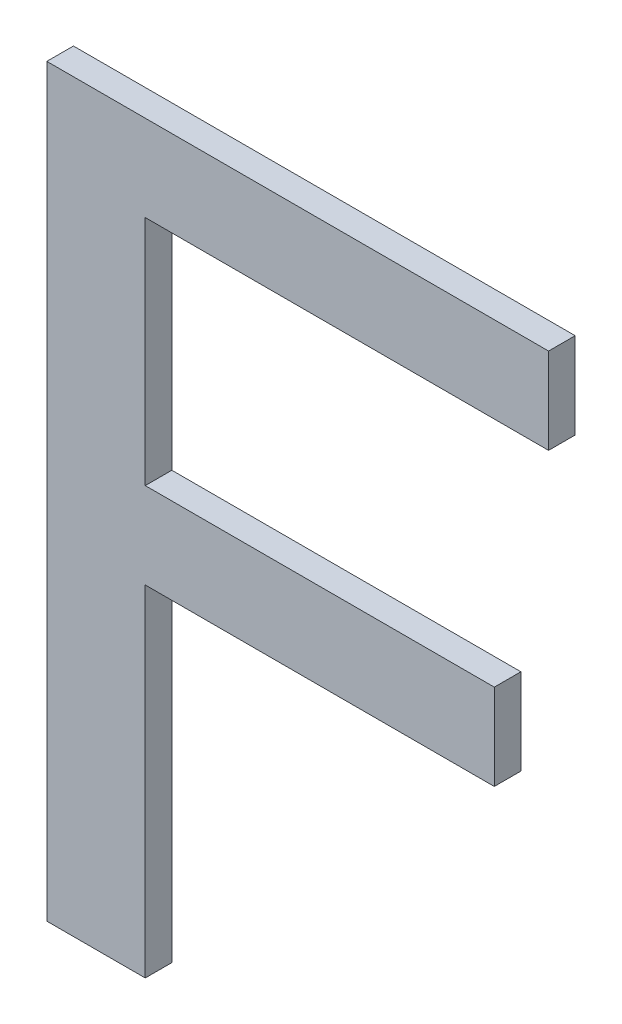
ISO-10303-21;
HEADER;
FILE_DESCRIPTION(('STEP AP214'),'2;1');
FILE_NAME('part.step','',(''),(''),'','','');
FILE_SCHEMA(('AUTOMOTIVE_DESIGN { 1 0 10303 214 1 1 1 1 }'));
ENDSEC;
DATA;
#1=APPLICATION_CONTEXT('core data for automotive mechanical design processes');
#2=APPLICATION_PROTOCOL_DEFINITION('international standard','automotive_design',2000,#1);
#3=PRODUCT_CONTEXT('',#1,'mechanical');
#4=PRODUCT('Part','Part','',(#3));
#5=PRODUCT_RELATED_PRODUCT_CATEGORY('part','',(#4));
#6=PRODUCT_DEFINITION_FORMATION('','',#4);
#7=PRODUCT_DEFINITION_CONTEXT('part definition',#1,'design');
#8=PRODUCT_DEFINITION('design','',#6,#7);
#9=PRODUCT_DEFINITION_SHAPE('','',#8);
#10=(LENGTH_UNIT() NAMED_UNIT(*) SI_UNIT(.MILLI.,.METRE.));
#11=(NAMED_UNIT(*) PLANE_ANGLE_UNIT() SI_UNIT($,.RADIAN.));
#12=(NAMED_UNIT(*) SI_UNIT($,.STERADIAN.) SOLID_ANGLE_UNIT());
#13=UNCERTAINTY_MEASURE_WITH_UNIT(LENGTH_MEASURE(1.E-05),#10,'distance_accuracy_value','');
#14=(GEOMETRIC_REPRESENTATION_CONTEXT(3) GLOBAL_UNCERTAINTY_ASSIGNED_CONTEXT((#13)) GLOBAL_UNIT_ASSIGNED_CONTEXT((#10,
#11,#12)) REPRESENTATION_CONTEXT('',''));
#15=CARTESIAN_POINT('',(0.,0.,0.));
#16=DIRECTION('',(0.,0.,1.));
#17=DIRECTION('',(1.,0.,0.));
#18=AXIS2_PLACEMENT_3D('',#15,#16,#17);
#19=CARTESIAN_POINT('',(10.115104482534,0.861077292451,0.05));
#20=DIRECTION('',(0.,0.,1.));
#21=DIRECTION('',(1.,0.,0.));
#22=AXIS2_PLACEMENT_3D('',#19,#20,#21);
#23=PLANE('',#22);
#24=DIRECTION('',(0.,1.,0.));
#25=VECTOR('',#24,1.);
#26=CARTESIAN_POINT('',(9.77316497093,0.,0.05));
#27=LINE('',#26,#25);
#28=CARTESIAN_POINT('',(9.77316497093,0.,0.05));
#29=VERTEX_POINT('',#28);
#30=CARTESIAN_POINT('',(9.77316497093,1.4,0.05));
#31=VERTEX_POINT('',#30);
#32=EDGE_CURVE('E144',#29,#31,#27,.T.);
#33=ORIENTED_EDGE('',*,*,#32,.F.);
#34=DIRECTION('',(-1.,0.,0.));
#35=VECTOR('',#34,1.);
#36=CARTESIAN_POINT('',(9.958212209302,0.,0.05));
#37=LINE('',#36,#35);
#38=CARTESIAN_POINT('',(9.958212209302,0.,0.05));
#39=VERTEX_POINT('',#38);
#40=EDGE_CURVE('E142',#39,#29,#37,.T.);
#41=ORIENTED_EDGE('',*,*,#40,.F.);
#42=DIRECTION('',(0.,-1.,0.));
#43=VECTOR('',#42,1.);
#44=CARTESIAN_POINT('',(9.958212209302,0.639970930233,0.05));
#45=LINE('',#44,#43);
#46=CARTESIAN_POINT('',(9.958212209302,0.639970930233,0.05));
#47=VERTEX_POINT('',#46);
#48=EDGE_CURVE('E130',#47,#39,#45,.T.);
#49=ORIENTED_EDGE('',*,*,#48,.F.);
#50=DIRECTION('',(-1.,0.,0.));
#51=VECTOR('',#50,1.);
#52=CARTESIAN_POINT('',(10.614462209302,0.639970930233,0.05));
#53=LINE('',#52,#51);
#54=CARTESIAN_POINT('',(10.614462209302,0.639970930233,0.05));
#55=VERTEX_POINT('',#54);
#56=EDGE_CURVE('E180',#55,#47,#53,.T.);
#57=ORIENTED_EDGE('',*,*,#56,.F.);
#58=DIRECTION('',(0.,-1.,0.));
#59=VECTOR('',#58,1.);
#60=CARTESIAN_POINT('',(10.614462209302,0.801744186047,0.05));
#61=LINE('',#60,#59);
#62=CARTESIAN_POINT('',(10.614462209302,0.801744186047,0.05));
#63=VERTEX_POINT('',#62);
#64=EDGE_CURVE('E203',#63,#55,#61,.T.);
#65=ORIENTED_EDGE('',*,*,#64,.F.);
#66=DIRECTION('',(1.,0.,0.));
#67=VECTOR('',#66,1.);
#68=CARTESIAN_POINT('',(9.958212209302,0.801744186047,0.05));
#69=LINE('',#68,#67);
#70=CARTESIAN_POINT('',(9.958212209302,0.801744186047,0.05));
#71=VERTEX_POINT('',#70);
#72=EDGE_CURVE('E173',#71,#63,#69,.T.);
#73=ORIENTED_EDGE('',*,*,#72,.F.);
#74=DIRECTION('',(0.,-1.,0.));
#75=VECTOR('',#74,1.);
#76=CARTESIAN_POINT('',(9.958212209302,1.238226744186,0.05));
#77=LINE('',#76,#75);
#78=CARTESIAN_POINT('',(9.958212209302,1.238226744186,0.05));
#79=VERTEX_POINT('',#78);
#80=EDGE_CURVE('E165',#79,#71,#77,.T.);
#81=ORIENTED_EDGE('',*,*,#80,.F.);
#82=DIRECTION('',(-1.,0.,0.));
#83=VECTOR('',#82,1.);
#84=CARTESIAN_POINT('',(10.71652434593,1.238226744186,0.05));
#85=LINE('',#84,#83);
#86=CARTESIAN_POINT('',(10.71652434593,1.238226744186,0.05));
#87=VERTEX_POINT('',#86);
#88=EDGE_CURVE('E63',#87,#79,#85,.T.);
#89=ORIENTED_EDGE('',*,*,#88,.F.);
#90=DIRECTION('',(0.,-1.,0.));
#91=VECTOR('',#90,1.);
#92=CARTESIAN_POINT('',(10.71652434593,1.4,0.05));
#93=LINE('',#92,#91);
#94=CARTESIAN_POINT('',(10.71652434593,1.4,0.05));
#95=VERTEX_POINT('',#94);
#96=EDGE_CURVE('E204',#95,#87,#93,.T.);
#97=ORIENTED_EDGE('',*,*,#96,.F.);
#98=DIRECTION('',(1.,0.,0.));
#99=VECTOR('',#98,1.);
#100=CARTESIAN_POINT('',(9.77316497093,1.4,0.05));
#101=LINE('',#100,#99);
#102=EDGE_CURVE('E28',#31,#95,#101,.T.);
#103=ORIENTED_EDGE('',*,*,#102,.F.);
#104=EDGE_LOOP('',(#33,#41,#49,#57,#65,#73,#81,#89,#97,#103));
#105=FACE_BOUND('',#104,.T.);
#106=ADVANCED_FACE('F17',(#105),#23,.T.);
#107=CARTESIAN_POINT('',(10.115104482534,0.861077292451,0.));
#108=DIRECTION('',(0.,0.,1.));
#109=DIRECTION('',(1.,0.,0.));
#110=AXIS2_PLACEMENT_3D('',#107,#108,#109);
#111=PLANE('',#110);
#112=DIRECTION('',(1.,0.,0.));
#113=VECTOR('',#112,1.);
#114=CARTESIAN_POINT('',(9.77316497093,1.4,0.));
#115=LINE('',#114,#113);
#116=CARTESIAN_POINT('',(9.77316497093,1.4,0.));
#117=VERTEX_POINT('',#116);
#118=CARTESIAN_POINT('',(10.71652434593,1.4,0.));
#119=VERTEX_POINT('',#118);
#120=EDGE_CURVE('E11',#117,#119,#115,.T.);
#121=ORIENTED_EDGE('',*,*,#120,.T.);
#122=DIRECTION('',(0.,-1.,0.));
#123=VECTOR('',#122,1.);
#124=CARTESIAN_POINT('',(10.71652434593,1.4,0.));
#125=LINE('',#124,#123);
#126=CARTESIAN_POINT('',(10.71652434593,1.238226744186,0.));
#127=VERTEX_POINT('',#126);
#128=EDGE_CURVE('E207',#119,#127,#125,.T.);
#129=ORIENTED_EDGE('',*,*,#128,.T.);
#130=DIRECTION('',(-1.,0.,0.));
#131=VECTOR('',#130,1.);
#132=CARTESIAN_POINT('',(10.71652434593,1.238226744186,0.));
#133=LINE('',#132,#131);
#134=CARTESIAN_POINT('',(9.958212209302,1.238226744186,0.));
#135=VERTEX_POINT('',#134);
#136=EDGE_CURVE('E77',#127,#135,#133,.T.);
#137=ORIENTED_EDGE('',*,*,#136,.T.);
#138=DIRECTION('',(0.,-1.,0.));
#139=VECTOR('',#138,1.);
#140=CARTESIAN_POINT('',(9.958212209302,1.238226744186,0.));
#141=LINE('',#140,#139);
#142=CARTESIAN_POINT('',(9.958212209302,0.801744186047,0.));
#143=VERTEX_POINT('',#142);
#144=EDGE_CURVE('E168',#135,#143,#141,.T.);
#145=ORIENTED_EDGE('',*,*,#144,.T.);
#146=DIRECTION('',(1.,0.,0.));
#147=VECTOR('',#146,1.);
#148=CARTESIAN_POINT('',(9.958212209302,0.801744186047,0.));
#149=LINE('',#148,#147);
#150=CARTESIAN_POINT('',(10.614462209302,0.801744186047,0.));
#151=VERTEX_POINT('',#150);
#152=EDGE_CURVE('E169',#143,#151,#149,.T.);
#153=ORIENTED_EDGE('',*,*,#152,.T.);
#154=DIRECTION('',(0.,-1.,0.));
#155=VECTOR('',#154,1.);
#156=CARTESIAN_POINT('',(10.614462209302,0.801744186047,0.));
#157=LINE('',#156,#155);
#158=CARTESIAN_POINT('',(10.614462209302,0.639970930233,0.));
#159=VERTEX_POINT('',#158);
#160=EDGE_CURVE('E212',#151,#159,#157,.T.);
#161=ORIENTED_EDGE('',*,*,#160,.T.);
#162=DIRECTION('',(-1.,0.,0.));
#163=VECTOR('',#162,1.);
#164=CARTESIAN_POINT('',(10.614462209302,0.639970930233,0.));
#165=LINE('',#164,#163);
#166=CARTESIAN_POINT('',(9.958212209302,0.639970930233,0.));
#167=VERTEX_POINT('',#166);
#168=EDGE_CURVE('E176',#159,#167,#165,.T.);
#169=ORIENTED_EDGE('',*,*,#168,.T.);
#170=DIRECTION('',(0.,-1.,0.));
#171=VECTOR('',#170,1.);
#172=CARTESIAN_POINT('',(9.958212209302,0.639970930233,0.));
#173=LINE('',#172,#171);
#174=CARTESIAN_POINT('',(9.958212209302,0.,0.));
#175=VERTEX_POINT('',#174);
#176=EDGE_CURVE('E121',#167,#175,#173,.T.);
#177=ORIENTED_EDGE('',*,*,#176,.T.);
#178=DIRECTION('',(-1.,0.,0.));
#179=VECTOR('',#178,1.);
#180=CARTESIAN_POINT('',(9.958212209302,0.,0.));
#181=LINE('',#180,#179);
#182=CARTESIAN_POINT('',(9.77316497093,0.,0.));
#183=VERTEX_POINT('',#182);
#184=EDGE_CURVE('E149',#175,#183,#181,.T.);
#185=ORIENTED_EDGE('',*,*,#184,.T.);
#186=DIRECTION('',(0.,1.,0.));
#187=VECTOR('',#186,1.);
#188=CARTESIAN_POINT('',(9.77316497093,0.,0.));
#189=LINE('',#188,#187);
#190=EDGE_CURVE('E153',#183,#117,#189,.T.);
#191=ORIENTED_EDGE('',*,*,#190,.T.);
#192=EDGE_LOOP('',(#121,#129,#137,#145,#153,#161,#169,#177,#185,#191));
#193=FACE_BOUND('',#192,.T.);
#194=ADVANCED_FACE('F245',(#193),#111,.F.);
#195=CARTESIAN_POINT('',(9.77316497093,1.4,0.));
#196=DIRECTION('',(0.,1.,0.));
#197=DIRECTION('',(1.,0.,0.));
#198=AXIS2_PLACEMENT_3D('',#195,#196,#197);
#199=PLANE('',#198);
#200=DIRECTION('',(0.,0.,1.));
#201=VECTOR('',#200,1.);
#202=CARTESIAN_POINT('',(9.77316497093,1.4,0.));
#203=LINE('',#202,#201);
#204=EDGE_CURVE('E159',#117,#31,#203,.T.);
#205=ORIENTED_EDGE('',*,*,#204,.T.);
#206=ORIENTED_EDGE('',*,*,#102,.T.);
#207=DIRECTION('',(0.,0.,1.));
#208=VECTOR('',#207,1.);
#209=CARTESIAN_POINT('',(10.71652434593,1.4,0.));
#210=LINE('',#209,#208);
#211=EDGE_CURVE('E21',#119,#95,#210,.T.);
#212=ORIENTED_EDGE('',*,*,#211,.F.);
#213=ORIENTED_EDGE('',*,*,#120,.F.);
#214=EDGE_LOOP('',(#205,#206,#212,#213));
#215=FACE_BOUND('',#214,.T.);
#216=ADVANCED_FACE('F310',(#215),#199,.T.);
#217=CARTESIAN_POINT('',(10.71652434593,1.4,0.));
#218=DIRECTION('',(1.,0.,0.));
#219=DIRECTION('',(0.,1.,0.));
#220=AXIS2_PLACEMENT_3D('',#217,#218,#219);
#221=PLANE('',#220);
#222=ORIENTED_EDGE('',*,*,#211,.T.);
#223=ORIENTED_EDGE('',*,*,#96,.T.);
#224=DIRECTION('',(0.,0.,1.));
#225=VECTOR('',#224,1.);
#226=CARTESIAN_POINT('',(10.71652434593,1.238226744186,0.));
#227=LINE('',#226,#225);
#228=EDGE_CURVE('E183',#127,#87,#227,.T.);
#229=ORIENTED_EDGE('',*,*,#228,.F.);
#230=ORIENTED_EDGE('',*,*,#128,.F.);
#231=EDGE_LOOP('',(#222,#223,#229,#230));
#232=FACE_BOUND('',#231,.T.);
#233=ADVANCED_FACE('F295',(#232),#221,.T.);
#234=CARTESIAN_POINT('',(10.71652434593,1.238226744186,0.));
#235=DIRECTION('',(0.,-1.,0.));
#236=DIRECTION('',(0.,0.,-1.));
#237=AXIS2_PLACEMENT_3D('',#234,#235,#236);
#238=PLANE('',#237);
#239=ORIENTED_EDGE('',*,*,#228,.T.);
#240=ORIENTED_EDGE('',*,*,#88,.T.);
#241=DIRECTION('',(0.,0.,1.));
#242=VECTOR('',#241,1.);
#243=CARTESIAN_POINT('',(9.958212209302,1.238226744186,0.));
#244=LINE('',#243,#242);
#245=EDGE_CURVE('E162',#135,#79,#244,.T.);
#246=ORIENTED_EDGE('',*,*,#245,.F.);
#247=ORIENTED_EDGE('',*,*,#136,.F.);
#248=EDGE_LOOP('',(#239,#240,#246,#247));
#249=FACE_BOUND('',#248,.T.);
#250=ADVANCED_FACE('F291',(#249),#238,.T.);
#251=CARTESIAN_POINT('',(9.958212209302,1.238226744186,0.));
#252=DIRECTION('',(1.,0.,0.));
#253=DIRECTION('',(0.,1.,0.));
#254=AXIS2_PLACEMENT_3D('',#251,#252,#253);
#255=PLANE('',#254);
#256=ORIENTED_EDGE('',*,*,#245,.T.);
#257=ORIENTED_EDGE('',*,*,#80,.T.);
#258=DIRECTION('',(0.,0.,1.));
#259=VECTOR('',#258,1.);
#260=CARTESIAN_POINT('',(9.958212209302,0.801744186047,0.));
#261=LINE('',#260,#259);
#262=EDGE_CURVE('E215',#143,#71,#261,.T.);
#263=ORIENTED_EDGE('',*,*,#262,.F.);
#264=ORIENTED_EDGE('',*,*,#144,.F.);
#265=EDGE_LOOP('',(#256,#257,#263,#264));
#266=FACE_BOUND('',#265,.T.);
#267=ADVANCED_FACE('F264',(#266),#255,.T.);
#268=CARTESIAN_POINT('',(9.958212209302,0.801744186047,0.));
#269=DIRECTION('',(0.,1.,0.));
#270=DIRECTION('',(1.,0.,0.));
#271=AXIS2_PLACEMENT_3D('',#268,#269,#270);
#272=PLANE('',#271);
#273=ORIENTED_EDGE('',*,*,#262,.T.);
#274=ORIENTED_EDGE('',*,*,#72,.T.);
#275=DIRECTION('',(0.,0.,1.));
#276=VECTOR('',#275,1.);
#277=CARTESIAN_POINT('',(10.614462209302,0.801744186047,0.));
#278=LINE('',#277,#276);
#279=EDGE_CURVE('E179',#151,#63,#278,.T.);
#280=ORIENTED_EDGE('',*,*,#279,.F.);
#281=ORIENTED_EDGE('',*,*,#152,.F.);
#282=EDGE_LOOP('',(#273,#274,#280,#281));
#283=FACE_BOUND('',#282,.T.);
#284=ADVANCED_FACE('F237',(#283),#272,.T.);
#285=CARTESIAN_POINT('',(10.614462209302,0.801744186047,0.));
#286=DIRECTION('',(1.,0.,0.));
#287=DIRECTION('',(0.,1.,0.));
#288=AXIS2_PLACEMENT_3D('',#285,#286,#287);
#289=PLANE('',#288);
#290=ORIENTED_EDGE('',*,*,#279,.T.);
#291=ORIENTED_EDGE('',*,*,#64,.T.);
#292=DIRECTION('',(0.,0.,1.));
#293=VECTOR('',#292,1.);
#294=CARTESIAN_POINT('',(10.614462209302,0.639970930233,0.));
#295=LINE('',#294,#293);
#296=EDGE_CURVE('E192',#159,#55,#295,.T.);
#297=ORIENTED_EDGE('',*,*,#296,.F.);
#298=ORIENTED_EDGE('',*,*,#160,.F.);
#299=EDGE_LOOP('',(#290,#291,#297,#298));
#300=FACE_BOUND('',#299,.T.);
#301=ADVANCED_FACE('F243',(#300),#289,.T.);
#302=CARTESIAN_POINT('',(10.614462209302,0.639970930233,0.));
#303=DIRECTION('',(0.,-1.,0.));
#304=DIRECTION('',(0.,0.,-1.));
#305=AXIS2_PLACEMENT_3D('',#302,#303,#304);
#306=PLANE('',#305);
#307=ORIENTED_EDGE('',*,*,#296,.T.);
#308=ORIENTED_EDGE('',*,*,#56,.T.);
#309=DIRECTION('',(0.,0.,1.));
#310=VECTOR('',#309,1.);
#311=CARTESIAN_POINT('',(9.958212209302,0.639970930233,0.));
#312=LINE('',#311,#310);
#313=EDGE_CURVE('E136',#167,#47,#312,.T.);
#314=ORIENTED_EDGE('',*,*,#313,.F.);
#315=ORIENTED_EDGE('',*,*,#168,.F.);
#316=EDGE_LOOP('',(#307,#308,#314,#315));
#317=FACE_BOUND('',#316,.T.);
#318=ADVANCED_FACE('F19',(#317),#306,.T.);
#319=CARTESIAN_POINT('',(9.958212209302,0.639970930233,0.));
#320=DIRECTION('',(1.,0.,0.));
#321=DIRECTION('',(0.,1.,0.));
#322=AXIS2_PLACEMENT_3D('',#319,#320,#321);
#323=PLANE('',#322);
#324=ORIENTED_EDGE('',*,*,#313,.T.);
#325=ORIENTED_EDGE('',*,*,#48,.T.);
#326=DIRECTION('',(0.,0.,1.));
#327=VECTOR('',#326,1.);
#328=CARTESIAN_POINT('',(9.958212209302,0.,0.));
#329=LINE('',#328,#327);
#330=EDGE_CURVE('E134',#175,#39,#329,.T.);
#331=ORIENTED_EDGE('',*,*,#330,.F.);
#332=ORIENTED_EDGE('',*,*,#176,.F.);
#333=EDGE_LOOP('',(#324,#325,#331,#332));
#334=FACE_BOUND('',#333,.T.);
#335=ADVANCED_FACE('F132',(#334),#323,.T.);
#336=CARTESIAN_POINT('',(9.958212209302,0.,0.));
#337=DIRECTION('',(0.,-1.,0.));
#338=DIRECTION('',(0.,0.,-1.));
#339=AXIS2_PLACEMENT_3D('',#336,#337,#338);
#340=PLANE('',#339);
#341=ORIENTED_EDGE('',*,*,#330,.T.);
#342=ORIENTED_EDGE('',*,*,#40,.T.);
#343=DIRECTION('',(0.,0.,1.));
#344=VECTOR('',#343,1.);
#345=CARTESIAN_POINT('',(9.77316497093,0.,0.));
#346=LINE('',#345,#344);
#347=EDGE_CURVE('E186',#183,#29,#346,.T.);
#348=ORIENTED_EDGE('',*,*,#347,.F.);
#349=ORIENTED_EDGE('',*,*,#184,.F.);
#350=EDGE_LOOP('',(#341,#342,#348,#349));
#351=FACE_BOUND('',#350,.T.);
#352=ADVANCED_FACE('F151',(#351),#340,.T.);
#353=CARTESIAN_POINT('',(9.77316497093,0.,0.));
#354=DIRECTION('',(-1.,0.,0.));
#355=DIRECTION('',(0.,0.,1.));
#356=AXIS2_PLACEMENT_3D('',#353,#354,#355);
#357=PLANE('',#356);
#358=ORIENTED_EDGE('',*,*,#347,.T.);
#359=ORIENTED_EDGE('',*,*,#32,.T.);
#360=ORIENTED_EDGE('',*,*,#204,.F.);
#361=ORIENTED_EDGE('',*,*,#190,.F.);
#362=EDGE_LOOP('',(#358,#359,#360,#361));
#363=FACE_BOUND('',#362,.T.);
#364=ADVANCED_FACE('F275',(#363),#357,.T.);
#365=CLOSED_SHELL('',(#106,#194,#216,#233,#250,#267,#284,#301,#318,#335,#352,#364));
#366=MANIFOLD_SOLID_BREP('B1',#365);
#367=ADVANCED_BREP_SHAPE_REPRESENTATION('',(#18,#366),#14);
#368=SHAPE_DEFINITION_REPRESENTATION(#9,#367);
ENDSEC;
END-ISO-10303-21;
